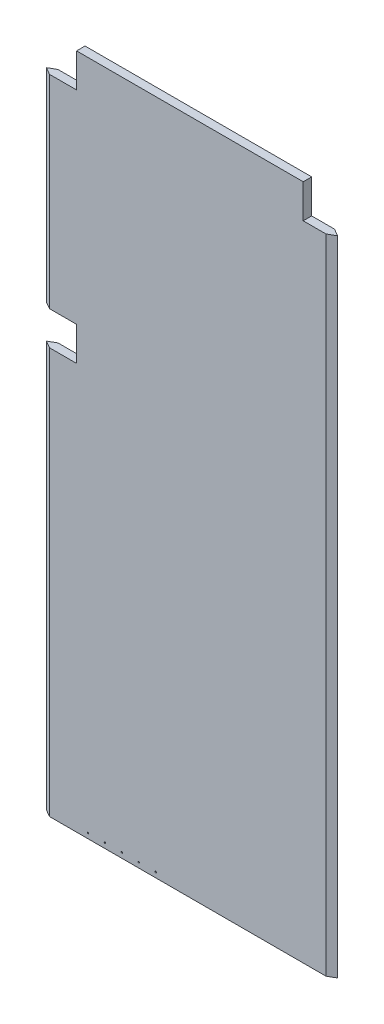
ISO-10303-21;
HEADER;
FILE_DESCRIPTION(('STEP AP214'),'2;1');
FILE_NAME('part.step','',(''),(''),'','','');
FILE_SCHEMA(('AUTOMOTIVE_DESIGN { 1 0 10303 214 1 1 1 1 }'));
ENDSEC;
DATA;
#1=APPLICATION_CONTEXT('core data for automotive mechanical design processes');
#2=APPLICATION_PROTOCOL_DEFINITION('international standard','automotive_design',2000,#1);
#3=PRODUCT_CONTEXT('',#1,'mechanical');
#4=PRODUCT('Part','Part','',(#3));
#5=PRODUCT_RELATED_PRODUCT_CATEGORY('part','',(#4));
#6=PRODUCT_DEFINITION_FORMATION('','',#4);
#7=PRODUCT_DEFINITION_CONTEXT('part definition',#1,'design');
#8=PRODUCT_DEFINITION('design','',#6,#7);
#9=PRODUCT_DEFINITION_SHAPE('','',#8);
#10=(LENGTH_UNIT() NAMED_UNIT(*) SI_UNIT(.MILLI.,.METRE.));
#11=(NAMED_UNIT(*) PLANE_ANGLE_UNIT() SI_UNIT($,.RADIAN.));
#12=(NAMED_UNIT(*) SI_UNIT($,.STERADIAN.) SOLID_ANGLE_UNIT());
#13=UNCERTAINTY_MEASURE_WITH_UNIT(LENGTH_MEASURE(1.E-05),#10,'distance_accuracy_value','');
#14=(GEOMETRIC_REPRESENTATION_CONTEXT(3) GLOBAL_UNCERTAINTY_ASSIGNED_CONTEXT((#13)) GLOBAL_UNIT_ASSIGNED_CONTEXT((#10,
#11,#12)) REPRESENTATION_CONTEXT('',''));
#15=CARTESIAN_POINT('',(0.,0.,0.));
#16=DIRECTION('',(0.,0.,1.));
#17=DIRECTION('',(1.,0.,0.));
#18=AXIS2_PLACEMENT_3D('',#15,#16,#17);
#19=CARTESIAN_POINT('',(0.,2000.,12.5));
#20=DIRECTION('',(0.,0.,-1.));
#21=DIRECTION('',(-1.,0.,0.));
#22=AXIS2_PLACEMENT_3D('',#19,#20,#21);
#23=PLANE('',#22);
#24=CARTESIAN_POINT('',(-241.225810728706,14.9999999999999,12.5));
#25=DIRECTION('',(0.,0.,1.));
#26=DIRECTION('',(1.,0.,0.));
#27=AXIS2_PLACEMENT_3D('',#24,#25,#26);
#28=CIRCLE('',#27,2.09999999999999);
#29=CARTESIAN_POINT('',(-239.125810728706,14.9999999999999,12.5));
#30=VERTEX_POINT('',#29);
#31=EDGE_CURVE('E324',#30,#30,#28,.T.);
#32=ORIENTED_EDGE('',*,*,#31,.F.);
#33=EDGE_LOOP('',(#32));
#34=FACE_BOUND('',#33,.T.);
#35=DIRECTION('',(0.,-1.,0.));
#36=VECTOR('',#35,1.);
#37=CARTESIAN_POINT('',(-375.,0.,12.5));
#38=LINE('',#37,#36);
#39=CARTESIAN_POINT('',(-375.,1300.,12.5));
#40=VERTEX_POINT('',#39);
#41=CARTESIAN_POINT('',(-375.,1200.,12.5));
#42=VERTEX_POINT('',#41);
#43=EDGE_CURVE('E292',#40,#42,#38,.T.);
#44=ORIENTED_EDGE('',*,*,#43,.T.);
#45=DIRECTION('',(1.,0.,0.));
#46=VECTOR('',#45,1.);
#47=CARTESIAN_POINT('',(0.,1200.,12.5));
#48=LINE('',#47,#46);
#49=CARTESIAN_POINT('',(-455.005810728706,1200.,12.4999999999999));
#50=VERTEX_POINT('',#49);
#51=EDGE_CURVE('E289',#50,#42,#48,.T.);
#52=ORIENTED_EDGE('',*,*,#51,.F.);
#53=DIRECTION('',(0.,-1.,0.));
#54=VECTOR('',#53,1.);
#55=CARTESIAN_POINT('',(-455.005810728706,2004.68540002039,12.4999999999999));
#56=LINE('',#55,#54);
#57=CARTESIAN_POINT('',(-455.005810728706,0.,12.4999999999999));
#58=VERTEX_POINT('',#57);
#59=EDGE_CURVE('E187',#50,#58,#56,.T.);
#60=ORIENTED_EDGE('',*,*,#59,.T.);
#61=DIRECTION('',(1.,0.,0.));
#62=VECTOR('',#61,1.);
#63=CARTESIAN_POINT('',(0.,0.,12.5));
#64=LINE('',#63,#62);
#65=CARTESIAN_POINT('',(362.411238514693,0.,12.5));
#66=VERTEX_POINT('',#65);
#67=EDGE_CURVE('E222',#58,#66,#64,.T.);
#68=ORIENTED_EDGE('',*,*,#67,.T.);
#69=DIRECTION('',(0.,-1.,0.));
#70=VECTOR('',#69,1.);
#71=CARTESIAN_POINT('',(362.411238514693,1992.55787694377,12.5));
#72=LINE('',#71,#70);
#73=CARTESIAN_POINT('',(362.411238514693,1900.,12.5));
#74=VERTEX_POINT('',#73);
#75=EDGE_CURVE('E197',#74,#66,#72,.T.);
#76=ORIENTED_EDGE('',*,*,#75,.F.);
#77=DIRECTION('',(1.,0.,0.));
#78=VECTOR('',#77,1.);
#79=CARTESIAN_POINT('',(294.944195316379,1900.,12.5));
#80=LINE('',#79,#78);
#81=CARTESIAN_POINT('',(294.944195316371,1900.,12.4999999999841));
#82=VERTEX_POINT('',#81);
#83=EDGE_CURVE('E199',#82,#74,#80,.T.);
#84=ORIENTED_EDGE('',*,*,#83,.F.);
#85=DIRECTION('',(0.,-1.,0.));
#86=VECTOR('',#85,1.);
#87=CARTESIAN_POINT('',(294.944195316371,2000.,12.5));
#88=LINE('',#87,#86);
#89=CARTESIAN_POINT('',(294.944195316371,2000.,12.5));
#90=VERTEX_POINT('',#89);
#91=EDGE_CURVE('E229',#90,#82,#88,.T.);
#92=ORIENTED_EDGE('',*,*,#91,.F.);
#93=DIRECTION('',(1.,0.,0.));
#94=VECTOR('',#93,1.);
#95=CARTESIAN_POINT('',(0.,2000.,12.5));
#96=LINE('',#95,#94);
#97=CARTESIAN_POINT('',(-375.,2000.,12.5));
#98=VERTEX_POINT('',#97);
#99=EDGE_CURVE('E227',#98,#90,#96,.T.);
#100=ORIENTED_EDGE('',*,*,#99,.F.);
#101=DIRECTION('',(0.,-1.,0.));
#102=VECTOR('',#101,1.);
#103=CARTESIAN_POINT('',(-375.,2000.,12.5));
#104=LINE('',#103,#102);
#105=CARTESIAN_POINT('',(-375.,1900.,12.5));
#106=VERTEX_POINT('',#105);
#107=EDGE_CURVE('E233',#98,#106,#104,.T.);
#108=ORIENTED_EDGE('',*,*,#107,.T.);
#109=DIRECTION('',(1.,0.,0.));
#110=VECTOR('',#109,1.);
#111=CARTESIAN_POINT('',(-375.,1900.,12.5));
#112=LINE('',#111,#110);
#113=CARTESIAN_POINT('',(-455.005810728706,1900.,12.4999999999999));
#114=VERTEX_POINT('',#113);
#115=EDGE_CURVE('E188',#114,#106,#112,.T.);
#116=ORIENTED_EDGE('',*,*,#115,.F.);
#117=CARTESIAN_POINT('',(-455.005810728706,1300.,12.4999999999999));
#118=VERTEX_POINT('',#117);
#119=EDGE_CURVE('E184',#114,#118,#56,.T.);
#120=ORIENTED_EDGE('',*,*,#119,.T.);
#121=DIRECTION('',(-1.,0.,0.));
#122=VECTOR('',#121,1.);
#123=CARTESIAN_POINT('',(0.,1300.,12.5));
#124=LINE('',#123,#122);
#125=EDGE_CURVE('E52',#40,#118,#124,.T.);
#126=ORIENTED_EDGE('',*,*,#125,.F.);
#127=EDGE_LOOP('',(#44,#52,#60,#68,#76,#84,#92,#100,#108,#116,#120,#126));
#128=FACE_BOUND('',#127,.T.);
#129=CARTESIAN_POINT('',(-341.225810728706,14.9999999999999,12.5));
#130=DIRECTION('',(0.,0.,1.));
#131=DIRECTION('',(1.,0.,0.));
#132=AXIS2_PLACEMENT_3D('',#129,#130,#131);
#133=CIRCLE('',#132,2.09999999999999);
#134=CARTESIAN_POINT('',(-339.125810728706,14.9999999999999,12.5));
#135=VERTEX_POINT('',#134);
#136=EDGE_CURVE('E310',#135,#135,#133,.T.);
#137=ORIENTED_EDGE('',*,*,#136,.F.);
#138=EDGE_LOOP('',(#137));
#139=FACE_BOUND('',#138,.T.);
#140=CARTESIAN_POINT('',(-291.225810728706,14.9999999999999,12.5));
#141=DIRECTION('',(0.,0.,1.));
#142=DIRECTION('',(1.,0.,0.));
#143=AXIS2_PLACEMENT_3D('',#140,#141,#142);
#144=CIRCLE('',#143,2.09999999999999);
#145=CARTESIAN_POINT('',(-289.125810728706,14.9999999999999,12.5));
#146=VERTEX_POINT('',#145);
#147=EDGE_CURVE('E318',#146,#146,#144,.T.);
#148=ORIENTED_EDGE('',*,*,#147,.F.);
#149=EDGE_LOOP('',(#148));
#150=FACE_BOUND('',#149,.T.);
#151=CARTESIAN_POINT('',(-191.225810728706,14.9999999999999,12.5));
#152=DIRECTION('',(0.,0.,1.));
#153=DIRECTION('',(1.,0.,0.));
#154=AXIS2_PLACEMENT_3D('',#151,#152,#153);
#155=CIRCLE('',#154,2.09999999999999);
#156=CARTESIAN_POINT('',(-189.125810728706,14.9999999999999,12.5));
#157=VERTEX_POINT('',#156);
#158=EDGE_CURVE('E330',#157,#157,#155,.T.);
#159=ORIENTED_EDGE('',*,*,#158,.F.);
#160=EDGE_LOOP('',(#159));
#161=FACE_BOUND('',#160,.T.);
#162=CARTESIAN_POINT('',(-141.225810728706,14.9999999999999,12.5));
#163=DIRECTION('',(0.,0.,1.));
#164=DIRECTION('',(1.,0.,0.));
#165=AXIS2_PLACEMENT_3D('',#162,#163,#164);
#166=CIRCLE('',#165,2.09999999999999);
#167=CARTESIAN_POINT('',(-139.125810728706,14.9999999999999,12.5));
#168=VERTEX_POINT('',#167);
#169=EDGE_CURVE('E336',#168,#168,#166,.T.);
#170=ORIENTED_EDGE('',*,*,#169,.F.);
#171=EDGE_LOOP('',(#170));
#172=FACE_BOUND('',#171,.T.);
#173=ADVANCED_FACE('F37',(#34,#128,#139,#150,#161,#172),#23,.F.);
#174=CARTESIAN_POINT('',(-476.65644582332,2004.68540002039,2.1316282072803E-11));
#175=DIRECTION('',(-0.500000000000001,0.,-0.866025403784438));
#176=DIRECTION('',(-0.866025403784438,0.,0.500000000000002));
#177=AXIS2_PLACEMENT_3D('',#174,#175,#176);
#178=PLANE('',#177);
#179=DIRECTION('',(0.866025403784438,0.,-0.500000000000001));
#180=VECTOR('',#179,1.);
#181=CARTESIAN_POINT('',(-124.577203242176,1200.,-203.273045480283));
#182=LINE('',#181,#180);
#183=CARTESIAN_POINT('',(-476.65644582332,1200.,2.1316282072803E-11));
#184=VERTEX_POINT('',#183);
#185=CARTESIAN_POINT('',(-455.005810728673,1200.,-12.4999999999999));
#186=VERTEX_POINT('',#185);
#187=EDGE_CURVE('E148',#184,#186,#182,.T.);
#188=ORIENTED_EDGE('',*,*,#187,.T.);
#189=DIRECTION('',(0.,-1.,0.));
#190=VECTOR('',#189,1.);
#191=CARTESIAN_POINT('',(-455.005810728673,2004.68540002039,-12.4999999999999));
#192=LINE('',#191,#190);
#193=CARTESIAN_POINT('',(-455.005810728673,0.,-12.4999999999999));
#194=VERTEX_POINT('',#193);
#195=EDGE_CURVE('E163',#186,#194,#192,.T.);
#196=ORIENTED_EDGE('',*,*,#195,.T.);
#197=DIRECTION('',(0.866025403784438,0.,-0.500000000000001));
#198=VECTOR('',#197,1.);
#199=CARTESIAN_POINT('',(-476.65644582332,0.,2.1316282072803E-11));
#200=LINE('',#199,#198);
#201=CARTESIAN_POINT('',(-476.65644582332,0.,2.1316282072803E-11));
#202=VERTEX_POINT('',#201);
#203=EDGE_CURVE('E181',#202,#194,#200,.T.);
#204=ORIENTED_EDGE('',*,*,#203,.F.);
#205=DIRECTION('',(0.,-1.,0.));
#206=VECTOR('',#205,1.);
#207=CARTESIAN_POINT('',(-476.65644582332,2004.68540002039,2.1316282072803E-11));
#208=LINE('',#207,#206);
#209=EDGE_CURVE('E165',#184,#202,#208,.T.);
#210=ORIENTED_EDGE('',*,*,#209,.F.);
#211=EDGE_LOOP('',(#188,#196,#204,#210));
#212=FACE_BOUND('',#211,.T.);
#213=ADVANCED_FACE('F161',(#212),#178,.T.);
#214=CARTESIAN_POINT('',(-455.005810728706,2004.68540002039,12.4999999999999));
#215=DIRECTION('',(-0.499999999999301,0.,0.866025403784842));
#216=DIRECTION('',(0.866025403784842,0.,0.499999999999301));
#217=AXIS2_PLACEMENT_3D('',#214,#215,#216);
#218=PLANE('',#217);
#219=DIRECTION('',(-0.866025403784842,0.,-0.499999999999301));
#220=VECTOR('',#219,1.);
#221=CARTESIAN_POINT('',(-113.751019669157,1200.,209.523545480113));
#222=LINE('',#221,#220);
#223=EDGE_CURVE('E166',#50,#184,#222,.T.);
#224=ORIENTED_EDGE('',*,*,#223,.T.);
#225=ORIENTED_EDGE('',*,*,#209,.T.);
#226=DIRECTION('',(-0.866025403784842,0.,-0.499999999999301));
#227=VECTOR('',#226,1.);
#228=CARTESIAN_POINT('',(-455.005810728706,0.,12.4999999999999));
#229=LINE('',#228,#227);
#230=EDGE_CURVE('E248',#58,#202,#229,.T.);
#231=ORIENTED_EDGE('',*,*,#230,.F.);
#232=ORIENTED_EDGE('',*,*,#59,.F.);
#233=EDGE_LOOP('',(#224,#225,#231,#232));
#234=FACE_BOUND('',#233,.T.);
#235=ADVANCED_FACE('F291',(#234),#218,.T.);
#236=CARTESIAN_POINT('',(-375.,2000.,0.));
#237=DIRECTION('',(1.,0.,0.));
#238=DIRECTION('',(0.,0.,-1.));
#239=AXIS2_PLACEMENT_3D('',#236,#237,#238);
#240=PLANE('',#239);
#241=DIRECTION('',(0.,0.,-1.));
#242=VECTOR('',#241,1.);
#243=CARTESIAN_POINT('',(-375.,1900.,-12.5));
#244=LINE('',#243,#242);
#245=CARTESIAN_POINT('',(-375.,1900.,-12.5000000000003));
#246=VERTEX_POINT('',#245);
#247=EDGE_CURVE('E60',#106,#246,#244,.T.);
#248=ORIENTED_EDGE('',*,*,#247,.F.);
#249=ORIENTED_EDGE('',*,*,#107,.F.);
#250=DIRECTION('',(0.,0.,1.));
#251=VECTOR('',#250,1.);
#252=CARTESIAN_POINT('',(-375.,2000.,0.));
#253=LINE('',#252,#251);
#254=CARTESIAN_POINT('',(-375.,2000.,-12.5));
#255=VERTEX_POINT('',#254);
#256=EDGE_CURVE('E225',#255,#98,#253,.T.);
#257=ORIENTED_EDGE('',*,*,#256,.F.);
#258=DIRECTION('',(0.,-1.,0.));
#259=VECTOR('',#258,1.);
#260=CARTESIAN_POINT('',(-375.,2000.,-12.5));
#261=LINE('',#260,#259);
#262=EDGE_CURVE('E45',#255,#246,#261,.T.);
#263=ORIENTED_EDGE('',*,*,#262,.T.);
#264=EDGE_LOOP('',(#248,#249,#257,#263));
#265=FACE_BOUND('',#264,.T.);
#266=ADVANCED_FACE('F235',(#265),#240,.F.);
#267=CARTESIAN_POINT('',(294.944195316371,2000.,-5.23926138591638E-12));
#268=DIRECTION('',(1.,0.,0.));
#269=DIRECTION('',(0.,0.,-1.));
#270=AXIS2_PLACEMENT_3D('',#267,#268,#269);
#271=PLANE('',#270);
#272=DIRECTION('',(0.,0.,1.));
#273=VECTOR('',#272,1.);
#274=CARTESIAN_POINT('',(294.944195316379,1900.,-12.5));
#275=LINE('',#274,#273);
#276=CARTESIAN_POINT('',(294.944195316371,1900.,-12.5));
#277=VERTEX_POINT('',#276);
#278=EDGE_CURVE('E201',#277,#82,#275,.T.);
#279=ORIENTED_EDGE('',*,*,#278,.F.);
#280=DIRECTION('',(0.,-1.,0.));
#281=VECTOR('',#280,1.);
#282=CARTESIAN_POINT('',(294.944195316371,2000.,-12.5));
#283=LINE('',#282,#281);
#284=CARTESIAN_POINT('',(294.944195316371,2000.,-12.5));
#285=VERTEX_POINT('',#284);
#286=EDGE_CURVE('E11',#285,#277,#283,.T.);
#287=ORIENTED_EDGE('',*,*,#286,.F.);
#288=DIRECTION('',(0.,0.,1.));
#289=VECTOR('',#288,1.);
#290=CARTESIAN_POINT('',(294.944195316371,2000.,-5.23926138591638E-12));
#291=LINE('',#290,#289);
#292=EDGE_CURVE('E218',#285,#90,#291,.T.);
#293=ORIENTED_EDGE('',*,*,#292,.T.);
#294=ORIENTED_EDGE('',*,*,#91,.T.);
#295=EDGE_LOOP('',(#279,#287,#293,#294));
#296=FACE_BOUND('',#295,.T.);
#297=ADVANCED_FACE('F39',(#296),#271,.T.);
#298=CARTESIAN_POINT('',(0.,2000.,-12.5));
#299=DIRECTION('',(0.,0.,-1.));
#300=DIRECTION('',(-1.,0.,0.));
#301=AXIS2_PLACEMENT_3D('',#298,#299,#300);
#302=PLANE('',#301);
#303=CARTESIAN_POINT('',(-141.225810728706,14.9999999999999,-12.5));
#304=DIRECTION('',(0.,0.,-1.));
#305=DIRECTION('',(-1.,0.,0.));
#306=AXIS2_PLACEMENT_3D('',#303,#304,#305);
#307=CIRCLE('',#306,2.09999999999999);
#308=CARTESIAN_POINT('',(-143.325810728706,14.9999999999999,-12.5));
#309=VERTEX_POINT('',#308);
#310=EDGE_CURVE('E333',#309,#309,#307,.T.);
#311=ORIENTED_EDGE('',*,*,#310,.F.);
#312=EDGE_LOOP('',(#311));
#313=FACE_BOUND('',#312,.T.);
#314=CARTESIAN_POINT('',(-191.225810728706,14.9999999999999,-12.5));
#315=DIRECTION('',(0.,0.,-1.));
#316=DIRECTION('',(-1.,0.,0.));
#317=AXIS2_PLACEMENT_3D('',#314,#315,#316);
#318=CIRCLE('',#317,2.09999999999999);
#319=CARTESIAN_POINT('',(-193.325810728706,14.9999999999999,-12.5));
#320=VERTEX_POINT('',#319);
#321=EDGE_CURVE('E327',#320,#320,#318,.T.);
#322=ORIENTED_EDGE('',*,*,#321,.F.);
#323=EDGE_LOOP('',(#322));
#324=FACE_BOUND('',#323,.T.);
#325=CARTESIAN_POINT('',(-241.225810728706,14.9999999999999,-12.5));
#326=DIRECTION('',(0.,0.,-1.));
#327=DIRECTION('',(-1.,0.,0.));
#328=AXIS2_PLACEMENT_3D('',#325,#326,#327);
#329=CIRCLE('',#328,2.09999999999999);
#330=CARTESIAN_POINT('',(-243.325810728706,14.9999999999999,-12.5));
#331=VERTEX_POINT('',#330);
#332=EDGE_CURVE('E321',#331,#331,#329,.T.);
#333=ORIENTED_EDGE('',*,*,#332,.F.);
#334=EDGE_LOOP('',(#333));
#335=FACE_BOUND('',#334,.T.);
#336=CARTESIAN_POINT('',(-291.225810728706,14.9999999999999,-12.5));
#337=DIRECTION('',(0.,0.,-1.));
#338=DIRECTION('',(-1.,0.,0.));
#339=AXIS2_PLACEMENT_3D('',#336,#337,#338);
#340=CIRCLE('',#339,2.09999999999999);
#341=CARTESIAN_POINT('',(-293.325810728706,14.9999999999999,-12.5));
#342=VERTEX_POINT('',#341);
#343=EDGE_CURVE('E315',#342,#342,#340,.T.);
#344=ORIENTED_EDGE('',*,*,#343,.F.);
#345=EDGE_LOOP('',(#344));
#346=FACE_BOUND('',#345,.T.);
#347=CARTESIAN_POINT('',(-341.225810728706,14.9999999999999,-12.5));
#348=DIRECTION('',(0.,0.,-1.));
#349=DIRECTION('',(-1.,0.,0.));
#350=AXIS2_PLACEMENT_3D('',#347,#348,#349);
#351=CIRCLE('',#350,2.09999999999999);
#352=CARTESIAN_POINT('',(-343.325810728706,14.9999999999999,-12.5));
#353=VERTEX_POINT('',#352);
#354=EDGE_CURVE('E308',#353,#353,#351,.T.);
#355=ORIENTED_EDGE('',*,*,#354,.F.);
#356=EDGE_LOOP('',(#355));
#357=FACE_BOUND('',#356,.T.);
#358=DIRECTION('',(-1.,0.,0.));
#359=VECTOR('',#358,1.);
#360=CARTESIAN_POINT('',(0.,1200.,-12.5));
#361=LINE('',#360,#359);
#362=CARTESIAN_POINT('',(-375.,1200.,-12.5));
#363=VERTEX_POINT('',#362);
#364=EDGE_CURVE('E145',#363,#186,#361,.T.);
#365=ORIENTED_EDGE('',*,*,#364,.F.);
#366=DIRECTION('',(0.,1.,0.));
#367=VECTOR('',#366,1.);
#368=CARTESIAN_POINT('',(-375.,0.,-12.5));
#369=LINE('',#368,#367);
#370=CARTESIAN_POINT('',(-375.,1300.,-12.5));
#371=VERTEX_POINT('',#370);
#372=EDGE_CURVE('E157',#363,#371,#369,.T.);
#373=ORIENTED_EDGE('',*,*,#372,.T.);
#374=DIRECTION('',(1.,0.,0.));
#375=VECTOR('',#374,1.);
#376=CARTESIAN_POINT('',(0.,1300.,-12.5));
#377=LINE('',#376,#375);
#378=CARTESIAN_POINT('',(-455.005810728672,1300.,-12.5));
#379=VERTEX_POINT('',#378);
#380=EDGE_CURVE('E298',#379,#371,#377,.T.);
#381=ORIENTED_EDGE('',*,*,#380,.F.);
#382=CARTESIAN_POINT('',(-455.005810728673,1900.,-12.4999999999999));
#383=VERTEX_POINT('',#382);
#384=EDGE_CURVE('E173',#383,#379,#192,.T.);
#385=ORIENTED_EDGE('',*,*,#384,.F.);
#386=DIRECTION('',(-1.,0.,0.));
#387=VECTOR('',#386,1.);
#388=CARTESIAN_POINT('',(-455.005810728673,1900.,-12.4999999999999));
#389=LINE('',#388,#387);
#390=EDGE_CURVE('E193',#246,#383,#389,.T.);
#391=ORIENTED_EDGE('',*,*,#390,.F.);
#392=ORIENTED_EDGE('',*,*,#262,.F.);
#393=DIRECTION('',(1.,0.,0.));
#394=VECTOR('',#393,1.);
#395=CARTESIAN_POINT('',(0.,2000.,-12.5));
#396=LINE('',#395,#394);
#397=EDGE_CURVE('E221',#255,#285,#396,.T.);
#398=ORIENTED_EDGE('',*,*,#397,.T.);
#399=ORIENTED_EDGE('',*,*,#286,.T.);
#400=DIRECTION('',(-1.,0.,0.));
#401=VECTOR('',#400,1.);
#402=CARTESIAN_POINT('',(362.411238514752,1900.,-12.5));
#403=LINE('',#402,#401);
#404=CARTESIAN_POINT('',(362.411238514752,1900.,-12.5));
#405=VERTEX_POINT('',#404);
#406=EDGE_CURVE('E213',#405,#277,#403,.T.);
#407=ORIENTED_EDGE('',*,*,#406,.F.);
#408=DIRECTION('',(0.,-1.,0.));
#409=VECTOR('',#408,1.);
#410=CARTESIAN_POINT('',(362.411238514752,1992.55787694377,-12.5));
#411=LINE('',#410,#409);
#412=CARTESIAN_POINT('',(362.411238514752,0.,-12.5));
#413=VERTEX_POINT('',#412);
#414=EDGE_CURVE('E207',#405,#413,#411,.T.);
#415=ORIENTED_EDGE('',*,*,#414,.T.);
#416=DIRECTION('',(1.,0.,0.));
#417=VECTOR('',#416,1.);
#418=CARTESIAN_POINT('',(0.,0.,-12.5));
#419=LINE('',#418,#417);
#420=EDGE_CURVE('E171',#194,#413,#419,.T.);
#421=ORIENTED_EDGE('',*,*,#420,.F.);
#422=ORIENTED_EDGE('',*,*,#195,.F.);
#423=EDGE_LOOP('',(#365,#373,#381,#385,#391,#392,#398,#399,#407,#415,#421,#422));
#424=FACE_BOUND('',#423,.T.);
#425=ADVANCED_FACE('F169',(#313,#324,#335,#346,#357,#424),#302,.T.);
#426=CARTESIAN_POINT('',(0.,2000.,0.));
#427=DIRECTION('',(0.,1.,0.));
#428=DIRECTION('',(0.,0.,1.));
#429=AXIS2_PLACEMENT_3D('',#426,#427,#428);
#430=PLANE('',#429);
#431=ORIENTED_EDGE('',*,*,#292,.F.);
#432=ORIENTED_EDGE('',*,*,#397,.F.);
#433=ORIENTED_EDGE('',*,*,#256,.T.);
#434=ORIENTED_EDGE('',*,*,#99,.T.);
#435=EDGE_LOOP('',(#431,#432,#433,#434));
#436=FACE_BOUND('',#435,.T.);
#437=ADVANCED_FACE('F270',(#436),#430,.T.);
#438=CARTESIAN_POINT('',(0.,0.,0.));
#439=DIRECTION('',(0.,1.,0.));
#440=DIRECTION('',(0.,0.,1.));
#441=AXIS2_PLACEMENT_3D('',#438,#439,#440);
#442=PLANE('',#441);
#443=ORIENTED_EDGE('',*,*,#420,.T.);
#444=DIRECTION('',(0.866025403785659,0.,0.499999999997887));
#445=VECTOR('',#444,1.);
#446=CARTESIAN_POINT('',(384.061873609394,0.,-5.20694598549198E-11));
#447=LINE('',#446,#445);
#448=CARTESIAN_POINT('',(384.061873609394,0.,-5.20694598549198E-11));
#449=VERTEX_POINT('',#448);
#450=EDGE_CURVE('E191',#413,#449,#447,.T.);
#451=ORIENTED_EDGE('',*,*,#450,.T.);
#452=DIRECTION('',(-0.866025403784439,0.,0.5));
#453=VECTOR('',#452,1.);
#454=CARTESIAN_POINT('',(362.411238514693,0.,12.5));
#455=LINE('',#454,#453);
#456=EDGE_CURVE('E204',#449,#66,#455,.T.);
#457=ORIENTED_EDGE('',*,*,#456,.T.);
#458=ORIENTED_EDGE('',*,*,#67,.F.);
#459=ORIENTED_EDGE('',*,*,#230,.T.);
#460=ORIENTED_EDGE('',*,*,#203,.T.);
#461=EDGE_LOOP('',(#443,#451,#457,#458,#459,#460));
#462=FACE_BOUND('',#461,.T.);
#463=ADVANCED_FACE('F283',(#462),#442,.F.);
#464=CARTESIAN_POINT('',(362.411238514693,1992.55787694377,12.5));
#465=DIRECTION('',(0.5,0.,0.866025403784439));
#466=DIRECTION('',(0.866025403784439,0.,-0.5));
#467=AXIS2_PLACEMENT_3D('',#464,#465,#466);
#468=PLANE('',#467);
#469=DIRECTION('',(0.866025403784439,0.,-0.5));
#470=VECTOR('',#469,1.);
#471=CARTESIAN_POINT('',(362.411238514693,1900.,12.5));
#472=LINE('',#471,#470);
#473=CARTESIAN_POINT('',(384.061873609394,1900.,-5.20846544381622E-11));
#474=VERTEX_POINT('',#473);
#475=EDGE_CURVE('E196',#74,#474,#472,.T.);
#476=ORIENTED_EDGE('',*,*,#475,.F.);
#477=ORIENTED_EDGE('',*,*,#75,.T.);
#478=ORIENTED_EDGE('',*,*,#456,.F.);
#479=DIRECTION('',(0.,-1.,0.));
#480=VECTOR('',#479,1.);
#481=CARTESIAN_POINT('',(384.061873609394,1992.55787694377,-5.20694598549198E-11));
#482=LINE('',#481,#480);
#483=EDGE_CURVE('E210',#474,#449,#482,.T.);
#484=ORIENTED_EDGE('',*,*,#483,.F.);
#485=EDGE_LOOP('',(#476,#477,#478,#484));
#486=FACE_BOUND('',#485,.T.);
#487=ADVANCED_FACE('F285',(#486),#468,.T.);
#488=CARTESIAN_POINT('',(384.061873609394,1992.55787694377,-5.20694598549198E-11));
#489=DIRECTION('',(0.499999999997887,0.,-0.866025403785658));
#490=DIRECTION('',(-0.866025403785659,0.,-0.499999999997887));
#491=AXIS2_PLACEMENT_3D('',#488,#489,#490);
#492=PLANE('',#491);
#493=DIRECTION('',(-0.866025403785659,0.,-0.499999999997887));
#494=VECTOR('',#493,1.);
#495=CARTESIAN_POINT('',(384.061873609394,1900.,-5.20694598549198E-11));
#496=LINE('',#495,#494);
#497=EDGE_CURVE('E194',#474,#405,#496,.T.);
#498=ORIENTED_EDGE('',*,*,#497,.F.);
#499=ORIENTED_EDGE('',*,*,#483,.T.);
#500=ORIENTED_EDGE('',*,*,#450,.F.);
#501=ORIENTED_EDGE('',*,*,#414,.F.);
#502=EDGE_LOOP('',(#498,#499,#500,#501));
#503=FACE_BOUND('',#502,.T.);
#504=ADVANCED_FACE('F281',(#503),#492,.T.);
#505=CARTESIAN_POINT('',(-1155.,1900.,-1.33226762955019E-12));
#506=DIRECTION('',(0.,-1.,0.));
#507=DIRECTION('',(1.,0.,0.));
#508=AXIS2_PLACEMENT_3D('',#505,#506,#507);
#509=PLANE('',#508);
#510=ORIENTED_EDGE('',*,*,#83,.T.);
#511=ORIENTED_EDGE('',*,*,#475,.T.);
#512=ORIENTED_EDGE('',*,*,#497,.T.);
#513=ORIENTED_EDGE('',*,*,#406,.T.);
#514=ORIENTED_EDGE('',*,*,#278,.T.);
#515=EDGE_LOOP('',(#510,#511,#512,#513,#514));
#516=FACE_BOUND('',#515,.T.);
#517=ADVANCED_FACE('F274',(#516),#509,.F.);
#518=DIRECTION('',(-0.866025403784438,0.,0.500000000000001));
#519=VECTOR('',#518,1.);
#520=CARTESIAN_POINT('',(-124.577203242176,1300.,-203.273045480283));
#521=LINE('',#520,#519);
#522=CARTESIAN_POINT('',(-476.65644582332,1300.,2.1316282072803E-11));
#523=VERTEX_POINT('',#522);
#524=EDGE_CURVE('E167',#379,#523,#521,.T.);
#525=ORIENTED_EDGE('',*,*,#524,.T.);
#526=CARTESIAN_POINT('',(-476.65644582332,1900.,2.13370987545147E-11));
#527=VERTEX_POINT('',#526);
#528=EDGE_CURVE('E174',#527,#523,#208,.T.);
#529=ORIENTED_EDGE('',*,*,#528,.F.);
#530=DIRECTION('',(-0.866025403784438,0.,0.500000000000002));
#531=VECTOR('',#530,1.);
#532=CARTESIAN_POINT('',(-476.65644582332,1900.,2.13107307356471E-11));
#533=LINE('',#532,#531);
#534=EDGE_CURVE('E244',#383,#527,#533,.T.);
#535=ORIENTED_EDGE('',*,*,#534,.F.);
#536=ORIENTED_EDGE('',*,*,#384,.T.);
#537=EDGE_LOOP('',(#525,#529,#535,#536));
#538=FACE_BOUND('',#537,.T.);
#539=ADVANCED_FACE('F307',(#538),#178,.T.);
#540=DIRECTION('',(0.866025403784842,0.,0.499999999999301));
#541=VECTOR('',#540,1.);
#542=CARTESIAN_POINT('',(-113.751019669157,1300.,209.523545480113));
#543=LINE('',#542,#541);
#544=EDGE_CURVE('E253',#523,#118,#543,.T.);
#545=ORIENTED_EDGE('',*,*,#544,.T.);
#546=ORIENTED_EDGE('',*,*,#119,.F.);
#547=DIRECTION('',(0.866025403784842,0.,0.499999999999301));
#548=VECTOR('',#547,1.);
#549=CARTESIAN_POINT('',(-455.005810728706,1900.,12.4999999999999));
#550=LINE('',#549,#548);
#551=EDGE_CURVE('E177',#527,#114,#550,.T.);
#552=ORIENTED_EDGE('',*,*,#551,.F.);
#553=ORIENTED_EDGE('',*,*,#528,.T.);
#554=EDGE_LOOP('',(#545,#546,#552,#553));
#555=FACE_BOUND('',#554,.T.);
#556=ADVANCED_FACE('F261',(#555),#218,.T.);
#557=CARTESIAN_POINT('',(-1155.,1900.,-1.27675647831893E-12));
#558=DIRECTION('',(0.,-1.,0.));
#559=DIRECTION('',(0.996194698091746,0.,0.0871557427476598));
#560=AXIS2_PLACEMENT_3D('',#557,#558,#559);
#561=PLANE('',#560);
#562=ORIENTED_EDGE('',*,*,#390,.T.);
#563=ORIENTED_EDGE('',*,*,#534,.T.);
#564=ORIENTED_EDGE('',*,*,#551,.T.);
#565=ORIENTED_EDGE('',*,*,#115,.T.);
#566=ORIENTED_EDGE('',*,*,#247,.T.);
#567=EDGE_LOOP('',(#562,#563,#564,#565,#566));
#568=FACE_BOUND('',#567,.T.);
#569=ADVANCED_FACE('F239',(#568),#561,.F.);
#570=CARTESIAN_POINT('',(0.,1200.,12.501));
#571=DIRECTION('',(0.,-1.,0.));
#572=DIRECTION('',(0.,0.,-1.));
#573=AXIS2_PLACEMENT_3D('',#570,#571,#572);
#574=PLANE('',#573);
#575=ORIENTED_EDGE('',*,*,#51,.T.);
#576=DIRECTION('',(0.,0.,-1.));
#577=VECTOR('',#576,1.);
#578=CARTESIAN_POINT('',(-375.,1200.,12.501));
#579=LINE('',#578,#577);
#580=EDGE_CURVE('E151',#42,#363,#579,.T.);
#581=ORIENTED_EDGE('',*,*,#580,.T.);
#582=ORIENTED_EDGE('',*,*,#364,.T.);
#583=ORIENTED_EDGE('',*,*,#187,.F.);
#584=ORIENTED_EDGE('',*,*,#223,.F.);
#585=EDGE_LOOP('',(#575,#581,#582,#583,#584));
#586=FACE_BOUND('',#585,.T.);
#587=ADVANCED_FACE('F147',(#586),#574,.F.);
#588=CARTESIAN_POINT('',(-375.,0.,12.501));
#589=DIRECTION('',(-1.,0.,0.));
#590=DIRECTION('',(0.,0.,1.));
#591=AXIS2_PLACEMENT_3D('',#588,#589,#590);
#592=PLANE('',#591);
#593=DIRECTION('',(0.,0.,-1.));
#594=VECTOR('',#593,1.);
#595=CARTESIAN_POINT('',(-375.,1300.,12.501));
#596=LINE('',#595,#594);
#597=EDGE_CURVE('E156',#40,#371,#596,.T.);
#598=ORIENTED_EDGE('',*,*,#597,.T.);
#599=ORIENTED_EDGE('',*,*,#372,.F.);
#600=ORIENTED_EDGE('',*,*,#580,.F.);
#601=ORIENTED_EDGE('',*,*,#43,.F.);
#602=EDGE_LOOP('',(#598,#599,#600,#601));
#603=FACE_BOUND('',#602,.T.);
#604=ADVANCED_FACE('F303',(#603),#592,.T.);
#605=CARTESIAN_POINT('',(0.,1300.,12.501));
#606=DIRECTION('',(0.,1.,0.));
#607=DIRECTION('',(0.,0.,1.));
#608=AXIS2_PLACEMENT_3D('',#605,#606,#607);
#609=PLANE('',#608);
#610=ORIENTED_EDGE('',*,*,#125,.T.);
#611=ORIENTED_EDGE('',*,*,#544,.F.);
#612=ORIENTED_EDGE('',*,*,#524,.F.);
#613=ORIENTED_EDGE('',*,*,#380,.T.);
#614=ORIENTED_EDGE('',*,*,#597,.F.);
#615=EDGE_LOOP('',(#610,#611,#612,#613,#614));
#616=FACE_BOUND('',#615,.T.);
#617=ADVANCED_FACE('F304',(#616),#609,.F.);
#618=CARTESIAN_POINT('',(-341.225810728706,14.9999999999999,12.5));
#619=DIRECTION('',(0.,0.,1.));
#620=DIRECTION('',(1.,0.,0.));
#621=AXIS2_PLACEMENT_3D('',#618,#619,#620);
#622=CYLINDRICAL_SURFACE('',#621,2.09999999999999);
#623=ORIENTED_EDGE('',*,*,#136,.T.);
#624=EDGE_LOOP('',(#623));
#625=FACE_BOUND('',#624,.T.);
#626=ORIENTED_EDGE('',*,*,#354,.T.);
#627=EDGE_LOOP('',(#626));
#628=FACE_BOUND('',#627,.T.);
#629=ADVANCED_FACE('F371',(#625,#628),#622,.F.);
#630=CARTESIAN_POINT('',(-291.225810728706,14.9999999999999,12.5));
#631=DIRECTION('',(0.,0.,1.));
#632=DIRECTION('',(1.,0.,0.));
#633=AXIS2_PLACEMENT_3D('',#630,#631,#632);
#634=CYLINDRICAL_SURFACE('',#633,2.09999999999999);
#635=ORIENTED_EDGE('',*,*,#147,.T.);
#636=EDGE_LOOP('',(#635));
#637=FACE_BOUND('',#636,.T.);
#638=ORIENTED_EDGE('',*,*,#343,.T.);
#639=EDGE_LOOP('',(#638));
#640=FACE_BOUND('',#639,.T.);
#641=ADVANCED_FACE('F373',(#637,#640),#634,.F.);
#642=CARTESIAN_POINT('',(-241.225810728706,14.9999999999999,12.5));
#643=DIRECTION('',(0.,0.,1.));
#644=DIRECTION('',(1.,0.,0.));
#645=AXIS2_PLACEMENT_3D('',#642,#643,#644);
#646=CYLINDRICAL_SURFACE('',#645,2.09999999999999);
#647=ORIENTED_EDGE('',*,*,#31,.T.);
#648=EDGE_LOOP('',(#647));
#649=FACE_BOUND('',#648,.T.);
#650=ORIENTED_EDGE('',*,*,#332,.T.);
#651=EDGE_LOOP('',(#650));
#652=FACE_BOUND('',#651,.T.);
#653=ADVANCED_FACE('F380',(#649,#652),#646,.F.);
#654=CARTESIAN_POINT('',(-191.225810728706,14.9999999999999,12.5));
#655=DIRECTION('',(0.,0.,1.));
#656=DIRECTION('',(1.,0.,0.));
#657=AXIS2_PLACEMENT_3D('',#654,#655,#656);
#658=CYLINDRICAL_SURFACE('',#657,2.09999999999999);
#659=ORIENTED_EDGE('',*,*,#158,.T.);
#660=EDGE_LOOP('',(#659));
#661=FACE_BOUND('',#660,.T.);
#662=ORIENTED_EDGE('',*,*,#321,.T.);
#663=EDGE_LOOP('',(#662));
#664=FACE_BOUND('',#663,.T.);
#665=ADVANCED_FACE('F469',(#661,#664),#658,.F.);
#666=CARTESIAN_POINT('',(-141.225810728706,14.9999999999999,12.5));
#667=DIRECTION('',(0.,0.,1.));
#668=DIRECTION('',(1.,0.,0.));
#669=AXIS2_PLACEMENT_3D('',#666,#667,#668);
#670=CYLINDRICAL_SURFACE('',#669,2.09999999999999);
#671=ORIENTED_EDGE('',*,*,#169,.T.);
#672=EDGE_LOOP('',(#671));
#673=FACE_BOUND('',#672,.T.);
#674=ORIENTED_EDGE('',*,*,#310,.T.);
#675=EDGE_LOOP('',(#674));
#676=FACE_BOUND('',#675,.T.);
#677=ADVANCED_FACE('F340',(#673,#676),#670,.F.);
#678=CLOSED_SHELL('',(#173,#213,#235,#266,#297,#425,#437,#463,#487,#504,#517,#539,#556,#569,
#587,#604,#617,#629,#641,#653,#665,#677));
#679=MANIFOLD_SOLID_BREP('B2',#678);
#680=ADVANCED_BREP_SHAPE_REPRESENTATION('',(#18,#679),#14);
#681=SHAPE_DEFINITION_REPRESENTATION(#9,#680);
ENDSEC;
END-ISO-10303-21;
